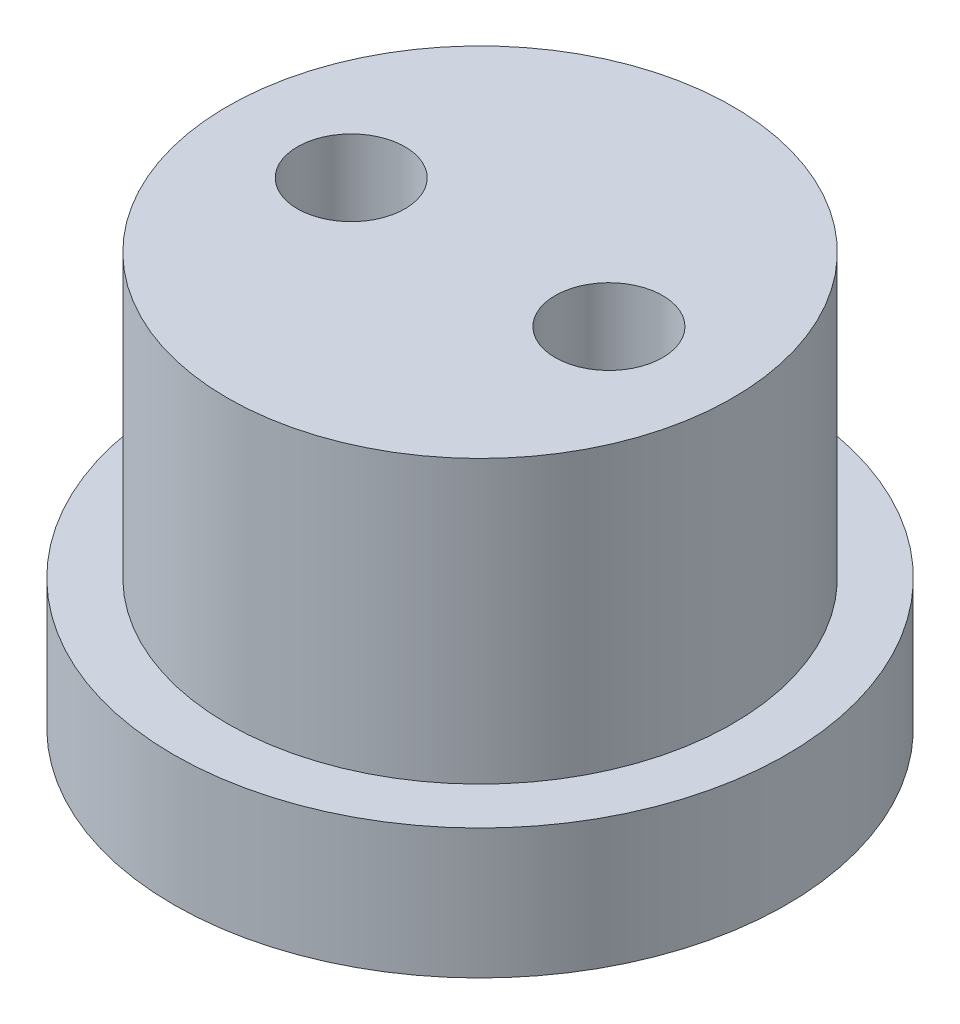
ISO-10303-21;
HEADER;
FILE_DESCRIPTION(('STEP AP214'),'2;1');
FILE_NAME('part.step','',(''),(''),'','','');
FILE_SCHEMA(('AUTOMOTIVE_DESIGN { 1 0 10303 214 1 1 1 1 }'));
ENDSEC;
DATA;
#1=APPLICATION_CONTEXT('core data for automotive mechanical design processes');
#2=APPLICATION_PROTOCOL_DEFINITION('international standard','automotive_design',2000,#1);
#3=PRODUCT_CONTEXT('',#1,'mechanical');
#4=PRODUCT('Part','Part','',(#3));
#5=PRODUCT_RELATED_PRODUCT_CATEGORY('part','',(#4));
#6=PRODUCT_DEFINITION_FORMATION('','',#4);
#7=PRODUCT_DEFINITION_CONTEXT('part definition',#1,'design');
#8=PRODUCT_DEFINITION('design','',#6,#7);
#9=PRODUCT_DEFINITION_SHAPE('','',#8);
#10=(LENGTH_UNIT() NAMED_UNIT(*) SI_UNIT(.MILLI.,.METRE.));
#11=(NAMED_UNIT(*) PLANE_ANGLE_UNIT() SI_UNIT($,.RADIAN.));
#12=(NAMED_UNIT(*) SI_UNIT($,.STERADIAN.) SOLID_ANGLE_UNIT());
#13=UNCERTAINTY_MEASURE_WITH_UNIT(LENGTH_MEASURE(1.E-05),#10,'distance_accuracy_value','');
#14=(GEOMETRIC_REPRESENTATION_CONTEXT(3) GLOBAL_UNCERTAINTY_ASSIGNED_CONTEXT((#13)) GLOBAL_UNIT_ASSIGNED_CONTEXT((#10,
#11,#12)) REPRESENTATION_CONTEXT('',''));
#15=CARTESIAN_POINT('',(0.,0.,0.));
#16=DIRECTION('',(0.,0.,1.));
#17=DIRECTION('',(1.,0.,0.));
#18=AXIS2_PLACEMENT_3D('',#15,#16,#17);
#19=CARTESIAN_POINT('',(0.,3.69040339472804,0.));
#20=DIRECTION('',(0.,1.,0.));
#21=DIRECTION('',(0.,0.,1.));
#22=AXIS2_PLACEMENT_3D('',#19,#20,#21);
#23=CYLINDRICAL_SURFACE('',#22,1.245);
#24=CARTESIAN_POINT('',(0.,2.03,0.));
#25=DIRECTION('',(0.,1.,0.));
#26=DIRECTION('',(0.,0.,1.));
#27=AXIS2_PLACEMENT_3D('',#24,#25,#26);
#28=CIRCLE('',#27,1.245);
#29=CARTESIAN_POINT('',(0.,2.03,1.245));
#30=VERTEX_POINT('',#29);
#31=EDGE_CURVE('E18',#30,#30,#28,.F.);
#32=ORIENTED_EDGE('',*,*,#31,.T.);
#33=EDGE_LOOP('',(#32));
#34=FACE_BOUND('',#33,.T.);
#35=CARTESIAN_POINT('',(0.,0.64,0.));
#36=DIRECTION('',(0.,1.,0.));
#37=DIRECTION('',(0.,0.,1.));
#38=AXIS2_PLACEMENT_3D('',#35,#36,#37);
#39=CIRCLE('',#38,1.245);
#40=CARTESIAN_POINT('',(0.,0.64,1.245));
#41=VERTEX_POINT('',#40);
#42=EDGE_CURVE('E40',#41,#41,#39,.T.);
#43=ORIENTED_EDGE('',*,*,#42,.T.);
#44=EDGE_LOOP('',(#43));
#45=FACE_BOUND('',#44,.T.);
#46=ADVANCED_FACE('F15',(#34,#45),#23,.T.);
#47=CARTESIAN_POINT('',(1.245,2.03,0.));
#48=DIRECTION('',(0.,-1.,0.));
#49=DIRECTION('',(0.,0.,-1.));
#50=AXIS2_PLACEMENT_3D('',#47,#48,#49);
#51=PLANE('',#50);
#52=ORIENTED_EDGE('',*,*,#31,.F.);
#53=EDGE_LOOP('',(#52));
#54=FACE_BOUND('',#53,.T.);
#55=CARTESIAN_POINT('',(0.635,2.03,0.));
#56=DIRECTION('',(0.,1.,0.));
#57=DIRECTION('',(0.,0.,1.));
#58=AXIS2_PLACEMENT_3D('',#55,#56,#57);
#59=CIRCLE('',#58,0.265);
#60=CARTESIAN_POINT('',(0.635,2.03,0.265));
#61=VERTEX_POINT('',#60);
#62=EDGE_CURVE('E35',#61,#61,#59,.F.);
#63=ORIENTED_EDGE('',*,*,#62,.T.);
#64=EDGE_LOOP('',(#63));
#65=FACE_BOUND('',#64,.T.);
#66=CARTESIAN_POINT('',(-0.635,2.03,0.));
#67=DIRECTION('',(0.,1.,0.));
#68=DIRECTION('',(0.,0.,1.));
#69=AXIS2_PLACEMENT_3D('',#66,#67,#68);
#70=CIRCLE('',#69,0.265);
#71=CARTESIAN_POINT('',(-0.635,2.03,0.265));
#72=VERTEX_POINT('',#71);
#73=EDGE_CURVE('E38',#72,#72,#70,.F.);
#74=ORIENTED_EDGE('',*,*,#73,.T.);
#75=EDGE_LOOP('',(#74));
#76=FACE_BOUND('',#75,.T.);
#77=ADVANCED_FACE('F48',(#54,#65,#76),#51,.F.);
#78=CARTESIAN_POINT('',(1.51,0.64,0.));
#79=DIRECTION('',(0.,-1.,0.));
#80=DIRECTION('',(0.,0.,-1.));
#81=AXIS2_PLACEMENT_3D('',#78,#79,#80);
#82=PLANE('',#81);
#83=CARTESIAN_POINT('',(0.,0.64,0.));
#84=DIRECTION('',(0.,1.,0.));
#85=DIRECTION('',(0.,0.,1.));
#86=AXIS2_PLACEMENT_3D('',#83,#84,#85);
#87=CIRCLE('',#86,1.51);
#88=CARTESIAN_POINT('',(0.,0.64,1.51));
#89=VERTEX_POINT('',#88);
#90=EDGE_CURVE('E32',#89,#89,#87,.F.);
#91=ORIENTED_EDGE('',*,*,#90,.F.);
#92=EDGE_LOOP('',(#91));
#93=FACE_BOUND('',#92,.T.);
#94=ORIENTED_EDGE('',*,*,#42,.F.);
#95=EDGE_LOOP('',(#94));
#96=FACE_BOUND('',#95,.T.);
#97=ADVANCED_FACE('F51',(#93,#96),#82,.F.);
#98=CARTESIAN_POINT('',(-0.635,0.,0.));
#99=DIRECTION('',(0.,1.,0.));
#100=DIRECTION('',(0.,0.,1.));
#101=AXIS2_PLACEMENT_3D('',#98,#99,#100);
#102=CYLINDRICAL_SURFACE('',#101,0.265);
#103=CARTESIAN_POINT('',(-0.635,0.,0.));
#104=DIRECTION('',(0.,1.,0.));
#105=DIRECTION('',(0.,0.,1.));
#106=AXIS2_PLACEMENT_3D('',#103,#104,#105);
#107=CIRCLE('',#106,0.265);
#108=CARTESIAN_POINT('',(-0.635,0.,0.265));
#109=VERTEX_POINT('',#108);
#110=EDGE_CURVE('E27',#109,#109,#107,.F.);
#111=ORIENTED_EDGE('',*,*,#110,.T.);
#112=EDGE_LOOP('',(#111));
#113=FACE_BOUND('',#112,.T.);
#114=ORIENTED_EDGE('',*,*,#73,.F.);
#115=EDGE_LOOP('',(#114));
#116=FACE_BOUND('',#115,.T.);
#117=ADVANCED_FACE('F56',(#113,#116),#102,.F.);
#118=CARTESIAN_POINT('',(0.635,0.,0.));
#119=DIRECTION('',(0.,1.,0.));
#120=DIRECTION('',(0.,0.,1.));
#121=AXIS2_PLACEMENT_3D('',#118,#119,#120);
#122=CYLINDRICAL_SURFACE('',#121,0.265);
#123=CARTESIAN_POINT('',(0.635,0.,0.));
#124=DIRECTION('',(0.,1.,0.));
#125=DIRECTION('',(0.,0.,1.));
#126=AXIS2_PLACEMENT_3D('',#123,#124,#125);
#127=CIRCLE('',#126,0.265);
#128=CARTESIAN_POINT('',(0.635,0.,0.265));
#129=VERTEX_POINT('',#128);
#130=EDGE_CURVE('E22',#129,#129,#127,.F.);
#131=ORIENTED_EDGE('',*,*,#130,.T.);
#132=EDGE_LOOP('',(#131));
#133=FACE_BOUND('',#132,.T.);
#134=ORIENTED_EDGE('',*,*,#62,.F.);
#135=EDGE_LOOP('',(#134));
#136=FACE_BOUND('',#135,.T.);
#137=ADVANCED_FACE('F58',(#133,#136),#122,.F.);
#138=CARTESIAN_POINT('',(0.,3.69040339472804,0.));
#139=DIRECTION('',(0.,1.,0.));
#140=DIRECTION('',(0.,0.,1.));
#141=AXIS2_PLACEMENT_3D('',#138,#139,#140);
#142=CYLINDRICAL_SURFACE('',#141,1.51);
#143=ORIENTED_EDGE('',*,*,#90,.T.);
#144=EDGE_LOOP('',(#143));
#145=FACE_BOUND('',#144,.T.);
#146=CARTESIAN_POINT('',(0.,0.,0.));
#147=DIRECTION('',(0.,1.,0.));
#148=DIRECTION('',(0.,0.,1.));
#149=AXIS2_PLACEMENT_3D('',#146,#147,#148);
#150=CIRCLE('',#149,1.51);
#151=CARTESIAN_POINT('',(0.,0.,1.51));
#152=VERTEX_POINT('',#151);
#153=EDGE_CURVE('E10',#152,#152,#150,.T.);
#154=ORIENTED_EDGE('',*,*,#153,.T.);
#155=EDGE_LOOP('',(#154));
#156=FACE_BOUND('',#155,.T.);
#157=ADVANCED_FACE('F66',(#145,#156),#142,.T.);
#158=CARTESIAN_POINT('',(0.,0.,0.));
#159=DIRECTION('',(0.,1.,0.));
#160=DIRECTION('',(0.,0.,1.));
#161=AXIS2_PLACEMENT_3D('',#158,#159,#160);
#162=PLANE('',#161);
#163=ORIENTED_EDGE('',*,*,#153,.F.);
#164=EDGE_LOOP('',(#163));
#165=FACE_BOUND('',#164,.T.);
#166=ORIENTED_EDGE('',*,*,#130,.F.);
#167=EDGE_LOOP('',(#166));
#168=FACE_BOUND('',#167,.T.);
#169=ORIENTED_EDGE('',*,*,#110,.F.);
#170=EDGE_LOOP('',(#169));
#171=FACE_BOUND('',#170,.T.);
#172=ADVANCED_FACE('F71',(#165,#168,#171),#162,.F.);
#173=CLOSED_SHELL('',(#46,#77,#97,#117,#137,#157,#172));
#174=MANIFOLD_SOLID_BREP('B1',#173);
#175=ADVANCED_BREP_SHAPE_REPRESENTATION('',(#18,#174),#14);
#176=SHAPE_DEFINITION_REPRESENTATION(#9,#175);
ENDSEC;
END-ISO-10303-21;
